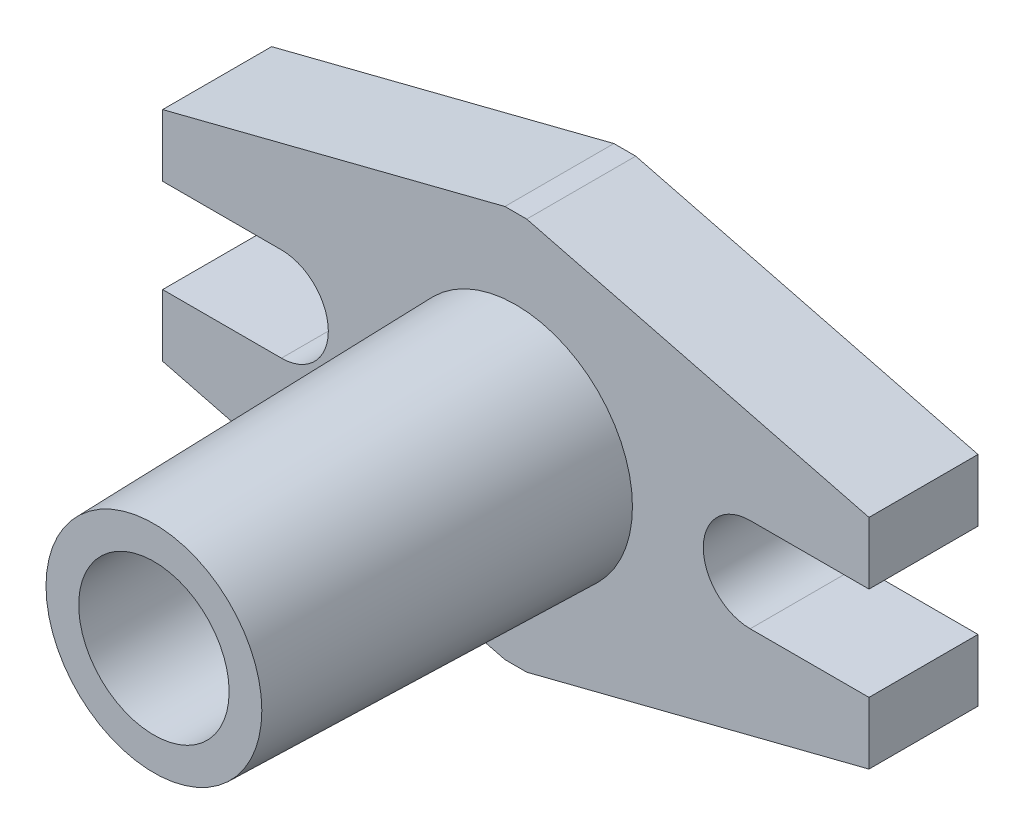
ISO-10303-21;
HEADER;
FILE_DESCRIPTION(('STEP AP214'),'2;1');
FILE_NAME('part.step','',(''),(''),'','','');
FILE_SCHEMA(('AUTOMOTIVE_DESIGN { 1 0 10303 214 1 1 1 1 }'));
ENDSEC;
DATA;
#1=APPLICATION_CONTEXT('core data for automotive mechanical design processes');
#2=APPLICATION_PROTOCOL_DEFINITION('international standard','automotive_design',2000,#1);
#3=PRODUCT_CONTEXT('',#1,'mechanical');
#4=PRODUCT('Part','Part','',(#3));
#5=PRODUCT_RELATED_PRODUCT_CATEGORY('part','',(#4));
#6=PRODUCT_DEFINITION_FORMATION('','',#4);
#7=PRODUCT_DEFINITION_CONTEXT('part definition',#1,'design');
#8=PRODUCT_DEFINITION('design','',#6,#7);
#9=PRODUCT_DEFINITION_SHAPE('','',#8);
#10=(LENGTH_UNIT() NAMED_UNIT(*) SI_UNIT(.MILLI.,.METRE.));
#11=(NAMED_UNIT(*) PLANE_ANGLE_UNIT() SI_UNIT($,.RADIAN.));
#12=(NAMED_UNIT(*) SI_UNIT($,.STERADIAN.) SOLID_ANGLE_UNIT());
#13=UNCERTAINTY_MEASURE_WITH_UNIT(LENGTH_MEASURE(1.E-05),#10,'distance_accuracy_value','');
#14=(GEOMETRIC_REPRESENTATION_CONTEXT(3) GLOBAL_UNCERTAINTY_ASSIGNED_CONTEXT((#13)) GLOBAL_UNIT_ASSIGNED_CONTEXT((#10,
#11,#12)) REPRESENTATION_CONTEXT('',''));
#15=CARTESIAN_POINT('',(0.,0.,0.));
#16=DIRECTION('',(0.,0.,1.));
#17=DIRECTION('',(1.,0.,0.));
#18=AXIS2_PLACEMENT_3D('',#15,#16,#17);
#19=CARTESIAN_POINT('',(-81.,-25.,25.));
#20=DIRECTION('',(0.246890062651995,0.969043495909081,0.));
#21=DIRECTION('',(-0.969043495909082,0.246890062651995,0.));
#22=AXIS2_PLACEMENT_3D('',#19,#20,#21);
#23=PLANE('',#22);
#24=DIRECTION('',(0.969043495909081,-0.246890062651995,0.));
#25=VECTOR('',#24,1.);
#26=CARTESIAN_POINT('',(-81.,-25.,0.));
#27=LINE('',#26,#25);
#28=CARTESIAN_POINT('',(-81.,-25.,0.));
#29=VERTEX_POINT('',#28);
#30=CARTESIAN_POINT('',(-2.5,-45.,0.));
#31=VERTEX_POINT('',#30);
#32=EDGE_CURVE('E179',#29,#31,#27,.T.);
#33=ORIENTED_EDGE('',*,*,#32,.T.);
#34=DIRECTION('',(0.,0.,-1.));
#35=VECTOR('',#34,1.);
#36=CARTESIAN_POINT('',(-2.5,-45.,25.));
#37=LINE('',#36,#35);
#38=CARTESIAN_POINT('',(-2.5,-45.,25.));
#39=VERTEX_POINT('',#38);
#40=EDGE_CURVE('E36',#39,#31,#37,.T.);
#41=ORIENTED_EDGE('',*,*,#40,.F.);
#42=DIRECTION('',(0.969043495909081,-0.246890062651995,0.));
#43=VECTOR('',#42,1.);
#44=CARTESIAN_POINT('',(-81.,-25.,25.));
#45=LINE('',#44,#43);
#46=CARTESIAN_POINT('',(-81.,-25.,25.));
#47=VERTEX_POINT('',#46);
#48=EDGE_CURVE('E210',#47,#39,#45,.T.);
#49=ORIENTED_EDGE('',*,*,#48,.F.);
#50=DIRECTION('',(0.,0.,-1.));
#51=VECTOR('',#50,1.);
#52=CARTESIAN_POINT('',(-81.,-25.,25.));
#53=LINE('',#52,#51);
#54=EDGE_CURVE('E175',#47,#29,#53,.T.);
#55=ORIENTED_EDGE('',*,*,#54,.T.);
#56=EDGE_LOOP('',(#33,#41,#49,#55));
#57=FACE_BOUND('',#56,.T.);
#58=ADVANCED_FACE('F33',(#57),#23,.F.);
#59=CARTESIAN_POINT('',(2.5,-45.,25.));
#60=DIRECTION('',(0.,1.,0.));
#61=DIRECTION('',(0.,0.,1.));
#62=AXIS2_PLACEMENT_3D('',#59,#60,#61);
#63=PLANE('',#62);
#64=DIRECTION('',(1.,0.,0.));
#65=VECTOR('',#64,1.);
#66=CARTESIAN_POINT('',(2.5,-45.,0.));
#67=LINE('',#66,#65);
#68=CARTESIAN_POINT('',(2.5,-45.,0.));
#69=VERTEX_POINT('',#68);
#70=EDGE_CURVE('E182',#31,#69,#67,.T.);
#71=ORIENTED_EDGE('',*,*,#70,.T.);
#72=DIRECTION('',(0.,0.,-1.));
#73=VECTOR('',#72,1.);
#74=CARTESIAN_POINT('',(2.5,-45.,25.));
#75=LINE('',#74,#73);
#76=CARTESIAN_POINT('',(2.5,-45.,25.));
#77=VERTEX_POINT('',#76);
#78=EDGE_CURVE('E243',#77,#69,#75,.T.);
#79=ORIENTED_EDGE('',*,*,#78,.F.);
#80=DIRECTION('',(1.,0.,0.));
#81=VECTOR('',#80,1.);
#82=CARTESIAN_POINT('',(2.5,-45.,25.));
#83=LINE('',#82,#81);
#84=EDGE_CURVE('E118',#39,#77,#83,.T.);
#85=ORIENTED_EDGE('',*,*,#84,.F.);
#86=ORIENTED_EDGE('',*,*,#40,.T.);
#87=EDGE_LOOP('',(#71,#79,#85,#86));
#88=FACE_BOUND('',#87,.T.);
#89=ADVANCED_FACE('F249',(#88),#63,.F.);
#90=CARTESIAN_POINT('',(81.,-25.,25.));
#91=DIRECTION('',(-0.246890062651995,0.969043495909081,0.));
#92=DIRECTION('',(-0.969043495909082,-0.246890062651995,0.));
#93=AXIS2_PLACEMENT_3D('',#90,#91,#92);
#94=PLANE('',#93);
#95=DIRECTION('',(0.969043495909081,0.246890062651995,0.));
#96=VECTOR('',#95,1.);
#97=CARTESIAN_POINT('',(81.,-25.,0.));
#98=LINE('',#97,#96);
#99=CARTESIAN_POINT('',(81.,-25.,0.));
#100=VERTEX_POINT('',#99);
#101=EDGE_CURVE('E185',#69,#100,#98,.T.);
#102=ORIENTED_EDGE('',*,*,#101,.T.);
#103=DIRECTION('',(0.,0.,-1.));
#104=VECTOR('',#103,1.);
#105=CARTESIAN_POINT('',(81.,-25.,25.));
#106=LINE('',#105,#104);
#107=CARTESIAN_POINT('',(81.,-25.,25.));
#108=VERTEX_POINT('',#107);
#109=EDGE_CURVE('E241',#108,#100,#106,.T.);
#110=ORIENTED_EDGE('',*,*,#109,.F.);
#111=DIRECTION('',(0.969043495909081,0.246890062651995,0.));
#112=VECTOR('',#111,1.);
#113=CARTESIAN_POINT('',(81.,-25.,25.));
#114=LINE('',#113,#112);
#115=EDGE_CURVE('E266',#77,#108,#114,.T.);
#116=ORIENTED_EDGE('',*,*,#115,.F.);
#117=ORIENTED_EDGE('',*,*,#78,.T.);
#118=EDGE_LOOP('',(#102,#110,#116,#117));
#119=FACE_BOUND('',#118,.T.);
#120=ADVANCED_FACE('F258',(#119),#94,.F.);
#121=CARTESIAN_POINT('',(81.,-10.75,25.));
#122=DIRECTION('',(-1.,0.,0.));
#123=DIRECTION('',(0.,-1.,0.));
#124=AXIS2_PLACEMENT_3D('',#121,#122,#123);
#125=PLANE('',#124);
#126=DIRECTION('',(0.,1.,0.));
#127=VECTOR('',#126,1.);
#128=CARTESIAN_POINT('',(81.,-10.75,0.));
#129=LINE('',#128,#127);
#130=CARTESIAN_POINT('',(81.,-10.75,0.));
#131=VERTEX_POINT('',#130);
#132=EDGE_CURVE('E187',#100,#131,#129,.T.);
#133=ORIENTED_EDGE('',*,*,#132,.T.);
#134=DIRECTION('',(0.,0.,-1.));
#135=VECTOR('',#134,1.);
#136=CARTESIAN_POINT('',(81.,-10.75,25.));
#137=LINE('',#136,#135);
#138=CARTESIAN_POINT('',(81.,-10.75,25.));
#139=VERTEX_POINT('',#138);
#140=EDGE_CURVE('E238',#139,#131,#137,.T.);
#141=ORIENTED_EDGE('',*,*,#140,.F.);
#142=DIRECTION('',(0.,1.,0.));
#143=VECTOR('',#142,1.);
#144=CARTESIAN_POINT('',(81.,-10.75,25.));
#145=LINE('',#144,#143);
#146=EDGE_CURVE('E263',#108,#139,#145,.T.);
#147=ORIENTED_EDGE('',*,*,#146,.F.);
#148=ORIENTED_EDGE('',*,*,#109,.T.);
#149=EDGE_LOOP('',(#133,#141,#147,#148));
#150=FACE_BOUND('',#149,.T.);
#151=ADVANCED_FACE('F261',(#150),#125,.F.);
#152=CARTESIAN_POINT('',(53.75,-10.75,25.));
#153=DIRECTION('',(0.,-1.,0.));
#154=DIRECTION('',(1.,0.,0.));
#155=AXIS2_PLACEMENT_3D('',#152,#153,#154);
#156=PLANE('',#155);
#157=DIRECTION('',(-1.,0.,0.));
#158=VECTOR('',#157,1.);
#159=CARTESIAN_POINT('',(53.75,-10.75,0.));
#160=LINE('',#159,#158);
#161=CARTESIAN_POINT('',(53.75,-10.75,0.));
#162=VERTEX_POINT('',#161);
#163=EDGE_CURVE('E189',#131,#162,#160,.T.);
#164=ORIENTED_EDGE('',*,*,#163,.T.);
#165=DIRECTION('',(0.,0.,-1.));
#166=VECTOR('',#165,1.);
#167=CARTESIAN_POINT('',(53.75,-10.75,25.));
#168=LINE('',#167,#166);
#169=CARTESIAN_POINT('',(53.75,-10.75,25.));
#170=VERTEX_POINT('',#169);
#171=EDGE_CURVE('E235',#170,#162,#168,.T.);
#172=ORIENTED_EDGE('',*,*,#171,.F.);
#173=DIRECTION('',(-1.,0.,0.));
#174=VECTOR('',#173,1.);
#175=CARTESIAN_POINT('',(53.75,-10.75,25.));
#176=LINE('',#175,#174);
#177=EDGE_CURVE('E265',#139,#170,#176,.T.);
#178=ORIENTED_EDGE('',*,*,#177,.F.);
#179=ORIENTED_EDGE('',*,*,#140,.T.);
#180=EDGE_LOOP('',(#164,#172,#178,#179));
#181=FACE_BOUND('',#180,.T.);
#182=ADVANCED_FACE('F325',(#181),#156,.F.);
#183=CARTESIAN_POINT('',(53.75,0.,25.));
#184=DIRECTION('',(0.,0.,-1.));
#185=DIRECTION('',(-1.,0.,0.));
#186=AXIS2_PLACEMENT_3D('',#183,#184,#185);
#187=CYLINDRICAL_SURFACE('',#186,10.75);
#188=CARTESIAN_POINT('',(53.75,0.,0.));
#189=DIRECTION('',(0.,0.,-1.));
#190=DIRECTION('',(-1.,0.,0.));
#191=AXIS2_PLACEMENT_3D('',#188,#189,#190);
#192=CIRCLE('',#191,10.75);
#193=CARTESIAN_POINT('',(53.75,10.75,0.));
#194=VERTEX_POINT('',#193);
#195=EDGE_CURVE('E191',#162,#194,#192,.T.);
#196=ORIENTED_EDGE('',*,*,#195,.T.);
#197=DIRECTION('',(0.,0.,-1.));
#198=VECTOR('',#197,1.);
#199=CARTESIAN_POINT('',(53.75,10.75,25.));
#200=LINE('',#199,#198);
#201=CARTESIAN_POINT('',(53.75,10.75,25.));
#202=VERTEX_POINT('',#201);
#203=EDGE_CURVE('E232',#202,#194,#200,.T.);
#204=ORIENTED_EDGE('',*,*,#203,.F.);
#205=CARTESIAN_POINT('',(53.75,0.,25.));
#206=DIRECTION('',(0.,0.,-1.));
#207=DIRECTION('',(-1.,0.,0.));
#208=AXIS2_PLACEMENT_3D('',#205,#206,#207);
#209=CIRCLE('',#208,10.75);
#210=EDGE_CURVE('E268',#170,#202,#209,.T.);
#211=ORIENTED_EDGE('',*,*,#210,.F.);
#212=ORIENTED_EDGE('',*,*,#171,.T.);
#213=EDGE_LOOP('',(#196,#204,#211,#212));
#214=FACE_BOUND('',#213,.T.);
#215=ADVANCED_FACE('F322',(#214),#187,.F.);
#216=CARTESIAN_POINT('',(81.,10.75,25.));
#217=DIRECTION('',(0.,1.,0.));
#218=DIRECTION('',(-1.,0.,0.));
#219=AXIS2_PLACEMENT_3D('',#216,#217,#218);
#220=PLANE('',#219);
#221=DIRECTION('',(1.,0.,0.));
#222=VECTOR('',#221,1.);
#223=CARTESIAN_POINT('',(81.,10.75,0.));
#224=LINE('',#223,#222);
#225=CARTESIAN_POINT('',(81.,10.75,0.));
#226=VERTEX_POINT('',#225);
#227=EDGE_CURVE('E193',#194,#226,#224,.T.);
#228=ORIENTED_EDGE('',*,*,#227,.T.);
#229=DIRECTION('',(0.,0.,-1.));
#230=VECTOR('',#229,1.);
#231=CARTESIAN_POINT('',(81.,10.75,25.));
#232=LINE('',#231,#230);
#233=CARTESIAN_POINT('',(81.,10.75,25.));
#234=VERTEX_POINT('',#233);
#235=EDGE_CURVE('E229',#234,#226,#232,.T.);
#236=ORIENTED_EDGE('',*,*,#235,.F.);
#237=DIRECTION('',(1.,0.,0.));
#238=VECTOR('',#237,1.);
#239=CARTESIAN_POINT('',(81.,10.75,25.));
#240=LINE('',#239,#238);
#241=EDGE_CURVE('E274',#202,#234,#240,.T.);
#242=ORIENTED_EDGE('',*,*,#241,.F.);
#243=ORIENTED_EDGE('',*,*,#203,.T.);
#244=EDGE_LOOP('',(#228,#236,#242,#243));
#245=FACE_BOUND('',#244,.T.);
#246=ADVANCED_FACE('F318',(#245),#220,.F.);
#247=CARTESIAN_POINT('',(81.,25.,25.));
#248=DIRECTION('',(-1.,0.,0.));
#249=DIRECTION('',(0.,-1.,0.));
#250=AXIS2_PLACEMENT_3D('',#247,#248,#249);
#251=PLANE('',#250);
#252=DIRECTION('',(0.,1.,0.));
#253=VECTOR('',#252,1.);
#254=CARTESIAN_POINT('',(81.,25.,0.));
#255=LINE('',#254,#253);
#256=CARTESIAN_POINT('',(81.,25.,0.));
#257=VERTEX_POINT('',#256);
#258=EDGE_CURVE('E195',#226,#257,#255,.T.);
#259=ORIENTED_EDGE('',*,*,#258,.T.);
#260=DIRECTION('',(0.,0.,-1.));
#261=VECTOR('',#260,1.);
#262=CARTESIAN_POINT('',(81.,25.,25.));
#263=LINE('',#262,#261);
#264=CARTESIAN_POINT('',(81.,25.,25.));
#265=VERTEX_POINT('',#264);
#266=EDGE_CURVE('E226',#265,#257,#263,.T.);
#267=ORIENTED_EDGE('',*,*,#266,.F.);
#268=DIRECTION('',(0.,1.,0.));
#269=VECTOR('',#268,1.);
#270=CARTESIAN_POINT('',(81.,25.,25.));
#271=LINE('',#270,#269);
#272=EDGE_CURVE('E276',#234,#265,#271,.T.);
#273=ORIENTED_EDGE('',*,*,#272,.F.);
#274=ORIENTED_EDGE('',*,*,#235,.T.);
#275=EDGE_LOOP('',(#259,#267,#273,#274));
#276=FACE_BOUND('',#275,.T.);
#277=ADVANCED_FACE('F313',(#276),#251,.F.);
#278=CARTESIAN_POINT('',(2.5,45.,25.));
#279=DIRECTION('',(-0.246890062651995,-0.969043495909081,0.));
#280=DIRECTION('',(0.969043495909082,-0.246890062651995,0.));
#281=AXIS2_PLACEMENT_3D('',#278,#279,#280);
#282=PLANE('',#281);
#283=DIRECTION('',(-0.969043495909081,0.246890062651995,0.));
#284=VECTOR('',#283,1.);
#285=CARTESIAN_POINT('',(2.5,45.,0.));
#286=LINE('',#285,#284);
#287=CARTESIAN_POINT('',(2.5,45.,0.));
#288=VERTEX_POINT('',#287);
#289=EDGE_CURVE('E197',#257,#288,#286,.T.);
#290=ORIENTED_EDGE('',*,*,#289,.T.);
#291=DIRECTION('',(0.,0.,-1.));
#292=VECTOR('',#291,1.);
#293=CARTESIAN_POINT('',(2.5,45.,25.));
#294=LINE('',#293,#292);
#295=CARTESIAN_POINT('',(2.5,45.,25.));
#296=VERTEX_POINT('',#295);
#297=EDGE_CURVE('E223',#296,#288,#294,.T.);
#298=ORIENTED_EDGE('',*,*,#297,.F.);
#299=DIRECTION('',(-0.969043495909081,0.246890062651995,0.));
#300=VECTOR('',#299,1.);
#301=CARTESIAN_POINT('',(2.5,45.,25.));
#302=LINE('',#301,#300);
#303=EDGE_CURVE('E278',#265,#296,#302,.T.);
#304=ORIENTED_EDGE('',*,*,#303,.F.);
#305=ORIENTED_EDGE('',*,*,#266,.T.);
#306=EDGE_LOOP('',(#290,#298,#304,#305));
#307=FACE_BOUND('',#306,.T.);
#308=ADVANCED_FACE('F307',(#307),#282,.F.);
#309=CARTESIAN_POINT('',(-2.5,45.,25.));
#310=DIRECTION('',(0.,-1.,0.));
#311=DIRECTION('',(0.,0.,-1.));
#312=AXIS2_PLACEMENT_3D('',#309,#310,#311);
#313=PLANE('',#312);
#314=DIRECTION('',(-1.,0.,0.));
#315=VECTOR('',#314,1.);
#316=CARTESIAN_POINT('',(-2.5,45.,0.));
#317=LINE('',#316,#315);
#318=CARTESIAN_POINT('',(-2.5,45.,0.));
#319=VERTEX_POINT('',#318);
#320=EDGE_CURVE('E199',#288,#319,#317,.T.);
#321=ORIENTED_EDGE('',*,*,#320,.T.);
#322=DIRECTION('',(0.,0.,-1.));
#323=VECTOR('',#322,1.);
#324=CARTESIAN_POINT('',(-2.5,45.,25.));
#325=LINE('',#324,#323);
#326=CARTESIAN_POINT('',(-2.5,45.,25.));
#327=VERTEX_POINT('',#326);
#328=EDGE_CURVE('E220',#327,#319,#325,.T.);
#329=ORIENTED_EDGE('',*,*,#328,.F.);
#330=DIRECTION('',(-1.,0.,0.));
#331=VECTOR('',#330,1.);
#332=CARTESIAN_POINT('',(-2.5,45.,25.));
#333=LINE('',#332,#331);
#334=EDGE_CURVE('E280',#296,#327,#333,.T.);
#335=ORIENTED_EDGE('',*,*,#334,.F.);
#336=ORIENTED_EDGE('',*,*,#297,.T.);
#337=EDGE_LOOP('',(#321,#329,#335,#336));
#338=FACE_BOUND('',#337,.T.);
#339=ADVANCED_FACE('F303',(#338),#313,.F.);
#340=CARTESIAN_POINT('',(-2.5,45.,25.));
#341=DIRECTION('',(0.246890062651995,-0.969043495909081,0.));
#342=DIRECTION('',(0.969043495909082,0.246890062651995,0.));
#343=AXIS2_PLACEMENT_3D('',#340,#341,#342);
#344=PLANE('',#343);
#345=DIRECTION('',(-0.969043495909081,-0.246890062651995,0.));
#346=VECTOR('',#345,1.);
#347=CARTESIAN_POINT('',(-2.5,45.,0.));
#348=LINE('',#347,#346);
#349=CARTESIAN_POINT('',(-81.,25.,0.));
#350=VERTEX_POINT('',#349);
#351=EDGE_CURVE('E201',#319,#350,#348,.T.);
#352=ORIENTED_EDGE('',*,*,#351,.T.);
#353=DIRECTION('',(0.,0.,-1.));
#354=VECTOR('',#353,1.);
#355=CARTESIAN_POINT('',(-81.,25.,25.));
#356=LINE('',#355,#354);
#357=CARTESIAN_POINT('',(-81.,25.,25.));
#358=VERTEX_POINT('',#357);
#359=EDGE_CURVE('E217',#358,#350,#356,.T.);
#360=ORIENTED_EDGE('',*,*,#359,.F.);
#361=DIRECTION('',(-0.969043495909081,-0.246890062651995,0.));
#362=VECTOR('',#361,1.);
#363=CARTESIAN_POINT('',(-2.5,45.,25.));
#364=LINE('',#363,#362);
#365=EDGE_CURVE('E282',#327,#358,#364,.T.);
#366=ORIENTED_EDGE('',*,*,#365,.F.);
#367=ORIENTED_EDGE('',*,*,#328,.T.);
#368=EDGE_LOOP('',(#352,#360,#366,#367));
#369=FACE_BOUND('',#368,.T.);
#370=ADVANCED_FACE('F299',(#369),#344,.F.);
#371=CARTESIAN_POINT('',(-81.,25.,25.));
#372=DIRECTION('',(1.,0.,0.));
#373=DIRECTION('',(0.,1.,0.));
#374=AXIS2_PLACEMENT_3D('',#371,#372,#373);
#375=PLANE('',#374);
#376=DIRECTION('',(0.,-1.,0.));
#377=VECTOR('',#376,1.);
#378=CARTESIAN_POINT('',(-81.,25.,0.));
#379=LINE('',#378,#377);
#380=CARTESIAN_POINT('',(-81.,10.75,0.));
#381=VERTEX_POINT('',#380);
#382=EDGE_CURVE('E203',#350,#381,#379,.T.);
#383=ORIENTED_EDGE('',*,*,#382,.T.);
#384=DIRECTION('',(0.,0.,-1.));
#385=VECTOR('',#384,1.);
#386=CARTESIAN_POINT('',(-81.,10.75,25.));
#387=LINE('',#386,#385);
#388=CARTESIAN_POINT('',(-81.,10.75,25.));
#389=VERTEX_POINT('',#388);
#390=EDGE_CURVE('E214',#389,#381,#387,.T.);
#391=ORIENTED_EDGE('',*,*,#390,.F.);
#392=DIRECTION('',(0.,-1.,0.));
#393=VECTOR('',#392,1.);
#394=CARTESIAN_POINT('',(-81.,25.,25.));
#395=LINE('',#394,#393);
#396=EDGE_CURVE('E284',#358,#389,#395,.T.);
#397=ORIENTED_EDGE('',*,*,#396,.F.);
#398=ORIENTED_EDGE('',*,*,#359,.T.);
#399=EDGE_LOOP('',(#383,#391,#397,#398));
#400=FACE_BOUND('',#399,.T.);
#401=ADVANCED_FACE('F290',(#400),#375,.F.);
#402=CARTESIAN_POINT('',(-81.,10.75,25.));
#403=DIRECTION('',(0.,1.,0.));
#404=DIRECTION('',(-1.,0.,0.));
#405=AXIS2_PLACEMENT_3D('',#402,#403,#404);
#406=PLANE('',#405);
#407=DIRECTION('',(1.,0.,0.));
#408=VECTOR('',#407,1.);
#409=CARTESIAN_POINT('',(-81.,10.75,0.));
#410=LINE('',#409,#408);
#411=CARTESIAN_POINT('',(-53.75,10.75,0.));
#412=VERTEX_POINT('',#411);
#413=EDGE_CURVE('E205',#381,#412,#410,.T.);
#414=ORIENTED_EDGE('',*,*,#413,.T.);
#415=DIRECTION('',(0.,0.,-1.));
#416=VECTOR('',#415,1.);
#417=CARTESIAN_POINT('',(-53.75,10.75,25.));
#418=LINE('',#417,#416);
#419=CARTESIAN_POINT('',(-53.75,10.75,25.));
#420=VERTEX_POINT('',#419);
#421=EDGE_CURVE('E170',#420,#412,#418,.T.);
#422=ORIENTED_EDGE('',*,*,#421,.F.);
#423=DIRECTION('',(1.,0.,0.));
#424=VECTOR('',#423,1.);
#425=CARTESIAN_POINT('',(-81.,10.75,25.));
#426=LINE('',#425,#424);
#427=EDGE_CURVE('E161',#389,#420,#426,.T.);
#428=ORIENTED_EDGE('',*,*,#427,.F.);
#429=ORIENTED_EDGE('',*,*,#390,.T.);
#430=EDGE_LOOP('',(#414,#422,#428,#429));
#431=FACE_BOUND('',#430,.T.);
#432=ADVANCED_FACE('F294',(#431),#406,.F.);
#433=CARTESIAN_POINT('',(-53.75,0.,25.));
#434=DIRECTION('',(0.,0.,-1.));
#435=DIRECTION('',(-1.,0.,0.));
#436=AXIS2_PLACEMENT_3D('',#433,#434,#435);
#437=CYLINDRICAL_SURFACE('',#436,10.75);
#438=CARTESIAN_POINT('',(-53.75,0.,0.));
#439=DIRECTION('',(0.,0.,-1.));
#440=DIRECTION('',(1.,0.,0.));
#441=AXIS2_PLACEMENT_3D('',#438,#439,#440);
#442=CIRCLE('',#441,10.75);
#443=CARTESIAN_POINT('',(-53.75,-10.75,0.));
#444=VERTEX_POINT('',#443);
#445=EDGE_CURVE('E169',#412,#444,#442,.T.);
#446=ORIENTED_EDGE('',*,*,#445,.T.);
#447=DIRECTION('',(0.,0.,-1.));
#448=VECTOR('',#447,1.);
#449=CARTESIAN_POINT('',(-53.75,-10.75,25.));
#450=LINE('',#449,#448);
#451=CARTESIAN_POINT('',(-53.75,-10.75,25.));
#452=VERTEX_POINT('',#451);
#453=EDGE_CURVE('E166',#452,#444,#450,.T.);
#454=ORIENTED_EDGE('',*,*,#453,.F.);
#455=CARTESIAN_POINT('',(-53.75,0.,25.));
#456=DIRECTION('',(0.,0.,-1.));
#457=DIRECTION('',(1.,0.,0.));
#458=AXIS2_PLACEMENT_3D('',#455,#456,#457);
#459=CIRCLE('',#458,10.75);
#460=EDGE_CURVE('E155',#420,#452,#459,.T.);
#461=ORIENTED_EDGE('',*,*,#460,.F.);
#462=ORIENTED_EDGE('',*,*,#421,.T.);
#463=EDGE_LOOP('',(#446,#454,#461,#462));
#464=FACE_BOUND('',#463,.T.);
#465=ADVANCED_FACE('F167',(#464),#437,.F.);
#466=CARTESIAN_POINT('',(-53.75,-10.75,25.));
#467=DIRECTION('',(0.,-1.,0.));
#468=DIRECTION('',(1.,0.,0.));
#469=AXIS2_PLACEMENT_3D('',#466,#467,#468);
#470=PLANE('',#469);
#471=DIRECTION('',(-1.,0.,0.));
#472=VECTOR('',#471,1.);
#473=CARTESIAN_POINT('',(-53.75,-10.75,0.));
#474=LINE('',#473,#472);
#475=CARTESIAN_POINT('',(-81.,-10.75,0.));
#476=VERTEX_POINT('',#475);
#477=EDGE_CURVE('E103',#444,#476,#474,.T.);
#478=ORIENTED_EDGE('',*,*,#477,.T.);
#479=DIRECTION('',(0.,0.,-1.));
#480=VECTOR('',#479,1.);
#481=CARTESIAN_POINT('',(-81.,-10.75,25.));
#482=LINE('',#481,#480);
#483=CARTESIAN_POINT('',(-81.,-10.75,25.));
#484=VERTEX_POINT('',#483);
#485=EDGE_CURVE('E171',#484,#476,#482,.T.);
#486=ORIENTED_EDGE('',*,*,#485,.F.);
#487=DIRECTION('',(-1.,0.,0.));
#488=VECTOR('',#487,1.);
#489=CARTESIAN_POINT('',(-53.75,-10.75,25.));
#490=LINE('',#489,#488);
#491=EDGE_CURVE('E159',#452,#484,#490,.T.);
#492=ORIENTED_EDGE('',*,*,#491,.F.);
#493=ORIENTED_EDGE('',*,*,#453,.T.);
#494=EDGE_LOOP('',(#478,#486,#492,#493));
#495=FACE_BOUND('',#494,.T.);
#496=ADVANCED_FACE('F173',(#495),#470,.F.);
#497=CARTESIAN_POINT('',(-81.,-10.75,25.));
#498=DIRECTION('',(1.,0.,0.));
#499=DIRECTION('',(0.,1.,0.));
#500=AXIS2_PLACEMENT_3D('',#497,#498,#499);
#501=PLANE('',#500);
#502=DIRECTION('',(0.,-1.,0.));
#503=VECTOR('',#502,1.);
#504=CARTESIAN_POINT('',(-81.,-10.75,0.));
#505=LINE('',#504,#503);
#506=EDGE_CURVE('E109',#476,#29,#505,.T.);
#507=ORIENTED_EDGE('',*,*,#506,.T.);
#508=ORIENTED_EDGE('',*,*,#54,.F.);
#509=DIRECTION('',(0.,-1.,0.));
#510=VECTOR('',#509,1.);
#511=CARTESIAN_POINT('',(-81.,-10.75,25.));
#512=LINE('',#511,#510);
#513=EDGE_CURVE('E50',#484,#47,#512,.T.);
#514=ORIENTED_EDGE('',*,*,#513,.F.);
#515=ORIENTED_EDGE('',*,*,#485,.T.);
#516=EDGE_LOOP('',(#507,#508,#514,#515));
#517=FACE_BOUND('',#516,.T.);
#518=ADVANCED_FACE('F431',(#517),#501,.F.);
#519=CARTESIAN_POINT('',(53.75,0.,25.));
#520=DIRECTION('',(0.,0.,-1.));
#521=DIRECTION('',(-1.,0.,0.));
#522=AXIS2_PLACEMENT_3D('',#519,#520,#521);
#523=PLANE('',#522);
#524=CARTESIAN_POINT('',(0.,0.,25.));
#525=DIRECTION('',(0.,0.,1.));
#526=DIRECTION('',(1.,0.,0.));
#527=AXIS2_PLACEMENT_3D('',#524,#525,#526);
#528=CIRCLE('',#527,26.75);
#529=CARTESIAN_POINT('',(26.75,0.,25.));
#530=VERTEX_POINT('',#529);
#531=EDGE_CURVE('E11',#530,#530,#528,.T.);
#532=ORIENTED_EDGE('',*,*,#531,.F.);
#533=EDGE_LOOP('',(#532));
#534=FACE_BOUND('',#533,.T.);
#535=ORIENTED_EDGE('',*,*,#48,.T.);
#536=ORIENTED_EDGE('',*,*,#84,.T.);
#537=ORIENTED_EDGE('',*,*,#115,.T.);
#538=ORIENTED_EDGE('',*,*,#146,.T.);
#539=ORIENTED_EDGE('',*,*,#177,.T.);
#540=ORIENTED_EDGE('',*,*,#210,.T.);
#541=ORIENTED_EDGE('',*,*,#241,.T.);
#542=ORIENTED_EDGE('',*,*,#272,.T.);
#543=ORIENTED_EDGE('',*,*,#303,.T.);
#544=ORIENTED_EDGE('',*,*,#334,.T.);
#545=ORIENTED_EDGE('',*,*,#365,.T.);
#546=ORIENTED_EDGE('',*,*,#396,.T.);
#547=ORIENTED_EDGE('',*,*,#427,.T.);
#548=ORIENTED_EDGE('',*,*,#460,.T.);
#549=ORIENTED_EDGE('',*,*,#491,.T.);
#550=ORIENTED_EDGE('',*,*,#513,.T.);
#551=EDGE_LOOP('',(#535,#536,#537,#538,#539,#540,#541,#542,#543,#544,#545,#546,#547,#548,#549,#550));
#552=FACE_BOUND('',#551,.T.);
#553=ADVANCED_FACE('F157',(#534,#552),#523,.F.);
#554=CARTESIAN_POINT('',(53.75,0.,0.));
#555=DIRECTION('',(0.,0.,-1.));
#556=DIRECTION('',(-1.,0.,0.));
#557=AXIS2_PLACEMENT_3D('',#554,#555,#556);
#558=PLANE('',#557);
#559=CARTESIAN_POINT('',(0.,0.,0.));
#560=DIRECTION('',(0.,0.,-1.));
#561=DIRECTION('',(-1.,0.,0.));
#562=AXIS2_PLACEMENT_3D('',#559,#560,#561);
#563=CIRCLE('',#562,17.25);
#564=CARTESIAN_POINT('',(-17.25,0.,0.));
#565=VERTEX_POINT('',#564);
#566=EDGE_CURVE('E494',#565,#565,#563,.F.);
#567=ORIENTED_EDGE('',*,*,#566,.T.);
#568=EDGE_LOOP('',(#567));
#569=FACE_BOUND('',#568,.T.);
#570=ORIENTED_EDGE('',*,*,#32,.F.);
#571=ORIENTED_EDGE('',*,*,#506,.F.);
#572=ORIENTED_EDGE('',*,*,#477,.F.);
#573=ORIENTED_EDGE('',*,*,#445,.F.);
#574=ORIENTED_EDGE('',*,*,#413,.F.);
#575=ORIENTED_EDGE('',*,*,#382,.F.);
#576=ORIENTED_EDGE('',*,*,#351,.F.);
#577=ORIENTED_EDGE('',*,*,#320,.F.);
#578=ORIENTED_EDGE('',*,*,#289,.F.);
#579=ORIENTED_EDGE('',*,*,#258,.F.);
#580=ORIENTED_EDGE('',*,*,#227,.F.);
#581=ORIENTED_EDGE('',*,*,#195,.F.);
#582=ORIENTED_EDGE('',*,*,#163,.F.);
#583=ORIENTED_EDGE('',*,*,#132,.F.);
#584=ORIENTED_EDGE('',*,*,#101,.F.);
#585=ORIENTED_EDGE('',*,*,#70,.F.);
#586=EDGE_LOOP('',(#570,#571,#572,#573,#574,#575,#576,#577,#578,#579,#580,#581,#582,#583,#584,#585));
#587=FACE_BOUND('',#586,.T.);
#588=ADVANCED_FACE('F254',(#569,#587),#558,.T.);
#589=CARTESIAN_POINT('',(0.,24.75,108.));
#590=DIRECTION('',(0.,0.,-1.));
#591=DIRECTION('',(-1.,0.,0.));
#592=AXIS2_PLACEMENT_3D('',#589,#590,#591);
#593=PLANE('',#592);
#594=CARTESIAN_POINT('',(0.,0.,108.));
#595=DIRECTION('',(0.,0.,1.));
#596=DIRECTION('',(1.,0.,0.));
#597=AXIS2_PLACEMENT_3D('',#594,#595,#596);
#598=CIRCLE('',#597,17.25);
#599=CARTESIAN_POINT('',(17.25,0.,108.));
#600=VERTEX_POINT('',#599);
#601=EDGE_CURVE('E497',#600,#600,#598,.T.);
#602=ORIENTED_EDGE('',*,*,#601,.F.);
#603=EDGE_LOOP('',(#602));
#604=FACE_BOUND('',#603,.T.);
#605=CARTESIAN_POINT('',(0.,0.,108.));
#606=DIRECTION('',(0.,0.,1.));
#607=DIRECTION('',(1.,0.,0.));
#608=AXIS2_PLACEMENT_3D('',#605,#606,#607);
#609=CIRCLE('',#608,24.75);
#610=CARTESIAN_POINT('',(24.75,0.,108.));
#611=VERTEX_POINT('',#610);
#612=EDGE_CURVE('E183',#611,#611,#609,.T.);
#613=ORIENTED_EDGE('',*,*,#612,.T.);
#614=EDGE_LOOP('',(#613));
#615=FACE_BOUND('',#614,.T.);
#616=ADVANCED_FACE('F461',(#604,#615),#593,.F.);
#617=CARTESIAN_POINT('',(0.,0.,25.));
#618=DIRECTION('',(0.,0.,-1.));
#619=DIRECTION('',(-1.,0.,0.));
#620=AXIS2_PLACEMENT_3D('',#617,#618,#619);
#621=CONICAL_SURFACE('',#620,26.75,0.0240917234249213);
#622=ORIENTED_EDGE('',*,*,#612,.F.);
#623=EDGE_LOOP('',(#622));
#624=FACE_BOUND('',#623,.T.);
#625=ORIENTED_EDGE('',*,*,#531,.T.);
#626=EDGE_LOOP('',(#625));
#627=FACE_BOUND('',#626,.T.);
#628=ADVANCED_FACE('F455',(#624,#627),#621,.T.);
#629=CARTESIAN_POINT('',(0.,0.,-0.001000000000001));
#630=DIRECTION('',(0.,0.,1.));
#631=DIRECTION('',(1.,0.,0.));
#632=AXIS2_PLACEMENT_3D('',#629,#630,#631);
#633=CYLINDRICAL_SURFACE('',#632,17.25);
#634=ORIENTED_EDGE('',*,*,#566,.F.);
#635=EDGE_LOOP('',(#634));
#636=FACE_BOUND('',#635,.T.);
#637=ORIENTED_EDGE('',*,*,#601,.T.);
#638=EDGE_LOOP('',(#637));
#639=FACE_BOUND('',#638,.T.);
#640=ADVANCED_FACE('F460',(#636,#639),#633,.F.);
#641=CLOSED_SHELL('',(#58,#89,#120,#151,#182,#215,#246,#277,#308,#339,#370,#401,#432,#465,#496,
#518,#553,#588,#616,#628,#640));
#642=MANIFOLD_SOLID_BREP('B2',#641);
#643=ADVANCED_BREP_SHAPE_REPRESENTATION('',(#18,#642),#14);
#644=SHAPE_DEFINITION_REPRESENTATION(#9,#643);
ENDSEC;
END-ISO-10303-21;
